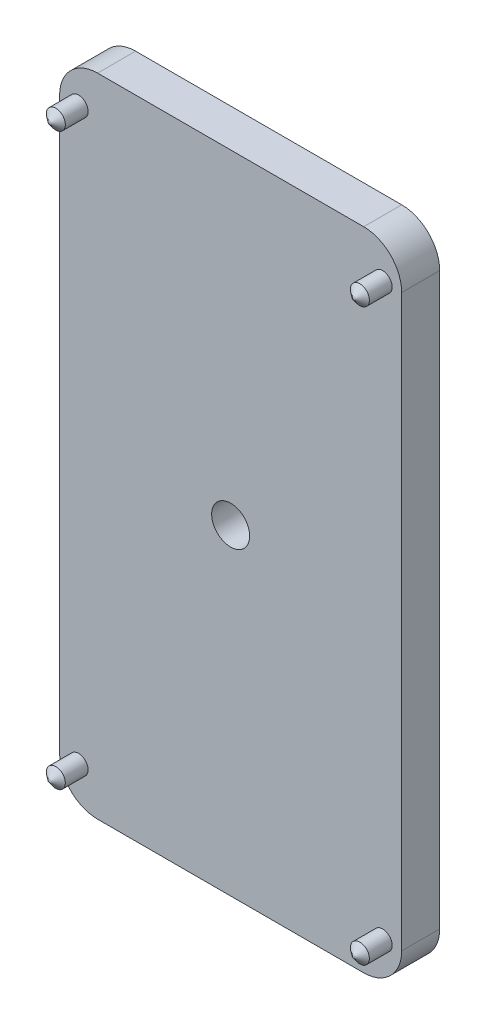
ISO-10303-21;
HEADER;
FILE_DESCRIPTION(('STEP AP214'),'2;1');
FILE_NAME('part.step','',(''),(''),'','','');
FILE_SCHEMA(('AUTOMOTIVE_DESIGN { 1 0 10303 214 1 1 1 1 }'));
ENDSEC;
DATA;
#1=APPLICATION_CONTEXT('core data for automotive mechanical design processes');
#2=APPLICATION_PROTOCOL_DEFINITION('international standard','automotive_design',2000,#1);
#3=PRODUCT_CONTEXT('',#1,'mechanical');
#4=PRODUCT('Part','Part','',(#3));
#5=PRODUCT_RELATED_PRODUCT_CATEGORY('part','',(#4));
#6=PRODUCT_DEFINITION_FORMATION('','',#4);
#7=PRODUCT_DEFINITION_CONTEXT('part definition',#1,'design');
#8=PRODUCT_DEFINITION('design','',#6,#7);
#9=PRODUCT_DEFINITION_SHAPE('','',#8);
#10=(LENGTH_UNIT() NAMED_UNIT(*) SI_UNIT(.MILLI.,.METRE.));
#11=(NAMED_UNIT(*) PLANE_ANGLE_UNIT() SI_UNIT($,.RADIAN.));
#12=(NAMED_UNIT(*) SI_UNIT($,.STERADIAN.) SOLID_ANGLE_UNIT());
#13=UNCERTAINTY_MEASURE_WITH_UNIT(LENGTH_MEASURE(1.E-05),#10,'distance_accuracy_value','');
#14=(GEOMETRIC_REPRESENTATION_CONTEXT(3) GLOBAL_UNCERTAINTY_ASSIGNED_CONTEXT((#13)) GLOBAL_UNIT_ASSIGNED_CONTEXT((#10,
#11,#12)) REPRESENTATION_CONTEXT('',''));
#15=CARTESIAN_POINT('',(0.,0.,0.));
#16=DIRECTION('',(0.,0.,1.));
#17=DIRECTION('',(1.,0.,0.));
#18=AXIS2_PLACEMENT_3D('',#15,#16,#17);
#19=CARTESIAN_POINT('',(0.,0.,0.));
#20=DIRECTION('',(0.,0.,-1.));
#21=DIRECTION('',(-1.,0.,0.));
#22=AXIS2_PLACEMENT_3D('',#19,#20,#21);
#23=PLANE('',#22);
#24=CARTESIAN_POINT('',(45.,84.5110045,0.));
#25=DIRECTION('',(0.,0.,-1.));
#26=DIRECTION('',(-1.,0.,0.));
#27=AXIS2_PLACEMENT_3D('',#24,#25,#26);
#28=CIRCLE('',#27,5.);
#29=CARTESIAN_POINT('',(40.,84.5110045,0.));
#30=VERTEX_POINT('',#29);
#31=EDGE_CURVE('E172',#30,#30,#28,.T.);
#32=ORIENTED_EDGE('',*,*,#31,.F.);
#33=EDGE_LOOP('',(#32));
#34=FACE_BOUND('',#33,.T.);
#35=DIRECTION('',(0.,1.,0.));
#36=VECTOR('',#35,1.);
#37=CARTESIAN_POINT('',(90.,0.,0.));
#38=LINE('',#37,#36);
#39=CARTESIAN_POINT('',(90.,10.,0.));
#40=VERTEX_POINT('',#39);
#41=CARTESIAN_POINT('',(90.,160.,0.));
#42=VERTEX_POINT('',#41);
#43=EDGE_CURVE('E153',#40,#42,#38,.T.);
#44=ORIENTED_EDGE('',*,*,#43,.F.);
#45=CARTESIAN_POINT('',(80.,10.,0.));
#46=DIRECTION('',(0.,0.,-1.));
#47=DIRECTION('',(-1.,0.,0.));
#48=AXIS2_PLACEMENT_3D('',#45,#46,#47);
#49=CIRCLE('',#48,10.);
#50=CARTESIAN_POINT('',(80.,0.,0.));
#51=VERTEX_POINT('',#50);
#52=EDGE_CURVE('E57',#40,#51,#49,.T.);
#53=ORIENTED_EDGE('',*,*,#52,.T.);
#54=DIRECTION('',(1.,0.,0.));
#55=VECTOR('',#54,1.);
#56=CARTESIAN_POINT('',(0.,0.,0.));
#57=LINE('',#56,#55);
#58=CARTESIAN_POINT('',(10.,0.,0.));
#59=VERTEX_POINT('',#58);
#60=EDGE_CURVE('E151',#59,#51,#57,.T.);
#61=ORIENTED_EDGE('',*,*,#60,.F.);
#62=CARTESIAN_POINT('',(10.,10.,0.));
#63=DIRECTION('',(0.,0.,-1.));
#64=DIRECTION('',(-1.,0.,0.));
#65=AXIS2_PLACEMENT_3D('',#62,#63,#64);
#66=CIRCLE('',#65,10.);
#67=CARTESIAN_POINT('',(0.,10.,0.));
#68=VERTEX_POINT('',#67);
#69=EDGE_CURVE('E195',#59,#68,#66,.T.);
#70=ORIENTED_EDGE('',*,*,#69,.T.);
#71=DIRECTION('',(0.,-1.,0.));
#72=VECTOR('',#71,1.);
#73=CARTESIAN_POINT('',(0.,0.,0.));
#74=LINE('',#73,#72);
#75=CARTESIAN_POINT('',(0.,160.,0.));
#76=VERTEX_POINT('',#75);
#77=EDGE_CURVE('E136',#76,#68,#74,.T.);
#78=ORIENTED_EDGE('',*,*,#77,.F.);
#79=CARTESIAN_POINT('',(10.,160.,0.));
#80=DIRECTION('',(0.,0.,-1.));
#81=DIRECTION('',(-1.,0.,0.));
#82=AXIS2_PLACEMENT_3D('',#79,#80,#81);
#83=CIRCLE('',#82,10.);
#84=CARTESIAN_POINT('',(10.,170.,0.));
#85=VERTEX_POINT('',#84);
#86=EDGE_CURVE('E186',#76,#85,#83,.T.);
#87=ORIENTED_EDGE('',*,*,#86,.T.);
#88=DIRECTION('',(-1.,0.,0.));
#89=VECTOR('',#88,1.);
#90=CARTESIAN_POINT('',(0.,170.,0.));
#91=LINE('',#90,#89);
#92=CARTESIAN_POINT('',(80.,170.,0.));
#93=VERTEX_POINT('',#92);
#94=EDGE_CURVE('E141',#93,#85,#91,.T.);
#95=ORIENTED_EDGE('',*,*,#94,.F.);
#96=CARTESIAN_POINT('',(80.,160.,0.));
#97=DIRECTION('',(0.,0.,-1.));
#98=DIRECTION('',(-1.,0.,0.));
#99=AXIS2_PLACEMENT_3D('',#96,#97,#98);
#100=CIRCLE('',#99,10.);
#101=EDGE_CURVE('E175',#93,#42,#100,.T.);
#102=ORIENTED_EDGE('',*,*,#101,.T.);
#103=EDGE_LOOP('',(#44,#53,#61,#70,#78,#87,#95,#102));
#104=FACE_BOUND('',#103,.T.);
#105=CARTESIAN_POINT('',(45.,150.,0.));
#106=DIRECTION('',(0.,0.,-1.));
#107=DIRECTION('',(-1.,0.,0.));
#108=AXIS2_PLACEMENT_3D('',#105,#106,#107);
#109=CIRCLE('',#108,2.5);
#110=CARTESIAN_POINT('',(42.5,150.,0.));
#111=VERTEX_POINT('',#110);
#112=EDGE_CURVE('E127',#111,#111,#109,.T.);
#113=ORIENTED_EDGE('',*,*,#112,.F.);
#114=EDGE_LOOP('',(#113));
#115=FACE_BOUND('',#114,.T.);
#116=ADVANCED_FACE('F35',(#34,#104,#115),#23,.T.);
#117=CARTESIAN_POINT('',(0.,0.,10.));
#118=DIRECTION('',(0.,0.,-1.));
#119=DIRECTION('',(-1.,0.,0.));
#120=AXIS2_PLACEMENT_3D('',#117,#118,#119);
#121=PLANE('',#120);
#122=CARTESIAN_POINT('',(45.,84.5110045,10.));
#123=DIRECTION('',(0.,0.,-1.));
#124=DIRECTION('',(-1.,0.,0.));
#125=AXIS2_PLACEMENT_3D('',#122,#123,#124);
#126=CIRCLE('',#125,5.);
#127=CARTESIAN_POINT('',(40.,84.5110045,10.));
#128=VERTEX_POINT('',#127);
#129=EDGE_CURVE('E169',#128,#128,#126,.T.);
#130=ORIENTED_EDGE('',*,*,#129,.T.);
#131=EDGE_LOOP('',(#130));
#132=FACE_BOUND('',#131,.T.);
#133=CARTESIAN_POINT('',(85.,10.,10.));
#134=DIRECTION('',(0.,0.,-1.));
#135=DIRECTION('',(-1.,0.,0.));
#136=AXIS2_PLACEMENT_3D('',#133,#134,#135);
#137=CIRCLE('',#136,2.5);
#138=CARTESIAN_POINT('',(82.5,10.,10.));
#139=VERTEX_POINT('',#138);
#140=EDGE_CURVE('E162',#139,#139,#137,.F.);
#141=ORIENTED_EDGE('',*,*,#140,.F.);
#142=EDGE_LOOP('',(#141));
#143=FACE_BOUND('',#142,.T.);
#144=CARTESIAN_POINT('',(5.,160.,10.));
#145=DIRECTION('',(0.,0.,-1.));
#146=DIRECTION('',(-1.,0.,0.));
#147=AXIS2_PLACEMENT_3D('',#144,#145,#146);
#148=CIRCLE('',#147,2.5);
#149=CARTESIAN_POINT('',(2.5,160.,10.));
#150=VERTEX_POINT('',#149);
#151=EDGE_CURVE('E148',#150,#150,#148,.F.);
#152=ORIENTED_EDGE('',*,*,#151,.F.);
#153=EDGE_LOOP('',(#152));
#154=FACE_BOUND('',#153,.T.);
#155=DIRECTION('',(1.,0.,0.));
#156=VECTOR('',#155,1.);
#157=CARTESIAN_POINT('',(0.,0.,10.));
#158=LINE('',#157,#156);
#159=CARTESIAN_POINT('',(10.,0.,10.));
#160=VERTEX_POINT('',#159);
#161=CARTESIAN_POINT('',(80.,0.,10.));
#162=VERTEX_POINT('',#161);
#163=EDGE_CURVE('E140',#160,#162,#158,.T.);
#164=ORIENTED_EDGE('',*,*,#163,.T.);
#165=CARTESIAN_POINT('',(80.,10.,10.));
#166=DIRECTION('',(0.,0.,-1.));
#167=DIRECTION('',(-1.,0.,0.));
#168=AXIS2_PLACEMENT_3D('',#165,#166,#167);
#169=CIRCLE('',#168,10.);
#170=CARTESIAN_POINT('',(90.,10.,10.));
#171=VERTEX_POINT('',#170);
#172=EDGE_CURVE('E11',#162,#171,#169,.F.);
#173=ORIENTED_EDGE('',*,*,#172,.T.);
#174=DIRECTION('',(0.,1.,0.));
#175=VECTOR('',#174,1.);
#176=CARTESIAN_POINT('',(90.,0.,10.));
#177=LINE('',#176,#175);
#178=CARTESIAN_POINT('',(90.,160.,10.));
#179=VERTEX_POINT('',#178);
#180=EDGE_CURVE('E143',#171,#179,#177,.T.);
#181=ORIENTED_EDGE('',*,*,#180,.T.);
#182=CARTESIAN_POINT('',(80.,160.,10.));
#183=DIRECTION('',(0.,0.,-1.));
#184=DIRECTION('',(-1.,0.,0.));
#185=AXIS2_PLACEMENT_3D('',#182,#183,#184);
#186=CIRCLE('',#185,10.);
#187=CARTESIAN_POINT('',(80.,170.,10.));
#188=VERTEX_POINT('',#187);
#189=EDGE_CURVE('E181',#179,#188,#186,.F.);
#190=ORIENTED_EDGE('',*,*,#189,.T.);
#191=DIRECTION('',(-1.,0.,0.));
#192=VECTOR('',#191,1.);
#193=CARTESIAN_POINT('',(0.,170.,10.));
#194=LINE('',#193,#192);
#195=CARTESIAN_POINT('',(10.,170.,10.));
#196=VERTEX_POINT('',#195);
#197=EDGE_CURVE('E145',#188,#196,#194,.T.);
#198=ORIENTED_EDGE('',*,*,#197,.T.);
#199=CARTESIAN_POINT('',(10.,160.,10.));
#200=DIRECTION('',(0.,0.,-1.));
#201=DIRECTION('',(-1.,0.,0.));
#202=AXIS2_PLACEMENT_3D('',#199,#200,#201);
#203=CIRCLE('',#202,10.);
#204=CARTESIAN_POINT('',(0.,160.,10.));
#205=VERTEX_POINT('',#204);
#206=EDGE_CURVE('E190',#196,#205,#203,.F.);
#207=ORIENTED_EDGE('',*,*,#206,.T.);
#208=DIRECTION('',(0.,-1.,0.));
#209=VECTOR('',#208,1.);
#210=CARTESIAN_POINT('',(0.,0.,10.));
#211=LINE('',#210,#209);
#212=CARTESIAN_POINT('',(0.,10.,10.));
#213=VERTEX_POINT('',#212);
#214=EDGE_CURVE('E137',#205,#213,#211,.T.);
#215=ORIENTED_EDGE('',*,*,#214,.T.);
#216=CARTESIAN_POINT('',(10.,10.,10.));
#217=DIRECTION('',(0.,0.,-1.));
#218=DIRECTION('',(-1.,0.,0.));
#219=AXIS2_PLACEMENT_3D('',#216,#217,#218);
#220=CIRCLE('',#219,10.);
#221=EDGE_CURVE('E199',#213,#160,#220,.F.);
#222=ORIENTED_EDGE('',*,*,#221,.T.);
#223=EDGE_LOOP('',(#164,#173,#181,#190,#198,#207,#215,#222));
#224=FACE_BOUND('',#223,.T.);
#225=CARTESIAN_POINT('',(85.,160.,10.));
#226=DIRECTION('',(0.,0.,-1.));
#227=DIRECTION('',(-1.,0.,0.));
#228=AXIS2_PLACEMENT_3D('',#225,#226,#227);
#229=CIRCLE('',#228,2.5);
#230=CARTESIAN_POINT('',(82.5,160.,10.));
#231=VERTEX_POINT('',#230);
#232=EDGE_CURVE('E159',#231,#231,#229,.F.);
#233=ORIENTED_EDGE('',*,*,#232,.F.);
#234=EDGE_LOOP('',(#233));
#235=FACE_BOUND('',#234,.T.);
#236=CARTESIAN_POINT('',(5.,10.,10.));
#237=DIRECTION('',(0.,0.,-1.));
#238=DIRECTION('',(-1.,0.,0.));
#239=AXIS2_PLACEMENT_3D('',#236,#237,#238);
#240=CIRCLE('',#239,2.5);
#241=CARTESIAN_POINT('',(2.5,10.,10.));
#242=VERTEX_POINT('',#241);
#243=EDGE_CURVE('E165',#242,#242,#240,.F.);
#244=ORIENTED_EDGE('',*,*,#243,.F.);
#245=EDGE_LOOP('',(#244));
#246=FACE_BOUND('',#245,.T.);
#247=ADVANCED_FACE('F219',(#132,#143,#154,#224,#235,#246),#121,.F.);
#248=CARTESIAN_POINT('',(0.,0.,10.));
#249=DIRECTION('',(1.,0.,0.));
#250=DIRECTION('',(0.,0.,-1.));
#251=AXIS2_PLACEMENT_3D('',#248,#249,#250);
#252=PLANE('',#251);
#253=ORIENTED_EDGE('',*,*,#77,.T.);
#254=DIRECTION('',(0.,0.,-1.));
#255=VECTOR('',#254,1.);
#256=CARTESIAN_POINT('',(0.,10.,10.));
#257=LINE('',#256,#255);
#258=EDGE_CURVE('E197',#68,#213,#257,.F.);
#259=ORIENTED_EDGE('',*,*,#258,.T.);
#260=ORIENTED_EDGE('',*,*,#214,.F.);
#261=DIRECTION('',(0.,0.,-1.));
#262=VECTOR('',#261,1.);
#263=CARTESIAN_POINT('',(0.,160.,10.));
#264=LINE('',#263,#262);
#265=EDGE_CURVE('E183',#205,#76,#264,.T.);
#266=ORIENTED_EDGE('',*,*,#265,.T.);
#267=EDGE_LOOP('',(#253,#259,#260,#266));
#268=FACE_BOUND('',#267,.T.);
#269=ADVANCED_FACE('F231',(#268),#252,.F.);
#270=CARTESIAN_POINT('',(0.,0.,10.));
#271=DIRECTION('',(0.,1.,0.));
#272=DIRECTION('',(0.,0.,1.));
#273=AXIS2_PLACEMENT_3D('',#270,#271,#272);
#274=PLANE('',#273);
#275=ORIENTED_EDGE('',*,*,#60,.T.);
#276=DIRECTION('',(0.,0.,-1.));
#277=VECTOR('',#276,1.);
#278=CARTESIAN_POINT('',(80.,0.,10.));
#279=LINE('',#278,#277);
#280=EDGE_CURVE('E43',#51,#162,#279,.F.);
#281=ORIENTED_EDGE('',*,*,#280,.T.);
#282=ORIENTED_EDGE('',*,*,#163,.F.);
#283=DIRECTION('',(0.,0.,-1.));
#284=VECTOR('',#283,1.);
#285=CARTESIAN_POINT('',(10.,0.,10.));
#286=LINE('',#285,#284);
#287=EDGE_CURVE('E192',#160,#59,#286,.T.);
#288=ORIENTED_EDGE('',*,*,#287,.T.);
#289=EDGE_LOOP('',(#275,#281,#282,#288));
#290=FACE_BOUND('',#289,.T.);
#291=ADVANCED_FACE('F237',(#290),#274,.F.);
#292=CARTESIAN_POINT('',(90.,0.,10.));
#293=DIRECTION('',(-1.,0.,0.));
#294=DIRECTION('',(0.,0.,1.));
#295=AXIS2_PLACEMENT_3D('',#292,#293,#294);
#296=PLANE('',#295);
#297=ORIENTED_EDGE('',*,*,#180,.F.);
#298=DIRECTION('',(0.,0.,-1.));
#299=VECTOR('',#298,1.);
#300=CARTESIAN_POINT('',(90.,10.,10.));
#301=LINE('',#300,#299);
#302=EDGE_CURVE('E201',#171,#40,#301,.T.);
#303=ORIENTED_EDGE('',*,*,#302,.T.);
#304=ORIENTED_EDGE('',*,*,#43,.T.);
#305=DIRECTION('',(0.,0.,-1.));
#306=VECTOR('',#305,1.);
#307=CARTESIAN_POINT('',(90.,160.,10.));
#308=LINE('',#307,#306);
#309=EDGE_CURVE('E178',#42,#179,#308,.F.);
#310=ORIENTED_EDGE('',*,*,#309,.T.);
#311=EDGE_LOOP('',(#297,#303,#304,#310));
#312=FACE_BOUND('',#311,.T.);
#313=ADVANCED_FACE('F207',(#312),#296,.F.);
#314=CARTESIAN_POINT('',(0.,170.,10.));
#315=DIRECTION('',(0.,-1.,0.));
#316=DIRECTION('',(0.,0.,-1.));
#317=AXIS2_PLACEMENT_3D('',#314,#315,#316);
#318=PLANE('',#317);
#319=ORIENTED_EDGE('',*,*,#94,.T.);
#320=DIRECTION('',(0.,0.,-1.));
#321=VECTOR('',#320,1.);
#322=CARTESIAN_POINT('',(10.,170.,10.));
#323=LINE('',#322,#321);
#324=EDGE_CURVE('E188',#85,#196,#323,.F.);
#325=ORIENTED_EDGE('',*,*,#324,.T.);
#326=ORIENTED_EDGE('',*,*,#197,.F.);
#327=DIRECTION('',(0.,0.,-1.));
#328=VECTOR('',#327,1.);
#329=CARTESIAN_POINT('',(80.,170.,10.));
#330=LINE('',#329,#328);
#331=EDGE_CURVE('E168',#188,#93,#330,.T.);
#332=ORIENTED_EDGE('',*,*,#331,.T.);
#333=EDGE_LOOP('',(#319,#325,#326,#332));
#334=FACE_BOUND('',#333,.T.);
#335=ADVANCED_FACE('F223',(#334),#318,.F.);
#336=CARTESIAN_POINT('',(5.,160.,16.));
#337=DIRECTION('',(0.,0.,-1.));
#338=DIRECTION('',(-1.,0.,0.));
#339=AXIS2_PLACEMENT_3D('',#336,#337,#338);
#340=CYLINDRICAL_SURFACE('',#339,2.5);
#341=CARTESIAN_POINT('',(5.,160.,16.));
#342=DIRECTION('',(0.,0.,1.));
#343=DIRECTION('',(1.,0.,0.));
#344=AXIS2_PLACEMENT_3D('',#341,#342,#343);
#345=CIRCLE('',#344,2.5);
#346=CARTESIAN_POINT('',(7.5,160.,16.));
#347=VERTEX_POINT('',#346);
#348=EDGE_CURVE('E133',#347,#347,#345,.T.);
#349=ORIENTED_EDGE('',*,*,#348,.F.);
#350=EDGE_LOOP('',(#349));
#351=FACE_BOUND('',#350,.T.);
#352=ORIENTED_EDGE('',*,*,#151,.T.);
#353=EDGE_LOOP('',(#352));
#354=FACE_BOUND('',#353,.T.);
#355=ADVANCED_FACE('F256',(#351,#354),#340,.T.);
#356=CARTESIAN_POINT('',(85.,160.,16.));
#357=DIRECTION('',(0.,0.,-1.));
#358=DIRECTION('',(-1.,0.,0.));
#359=AXIS2_PLACEMENT_3D('',#356,#357,#358);
#360=CYLINDRICAL_SURFACE('',#359,2.5);
#361=CARTESIAN_POINT('',(85.,160.,16.));
#362=DIRECTION('',(0.,0.,1.));
#363=DIRECTION('',(1.,0.,0.));
#364=AXIS2_PLACEMENT_3D('',#361,#362,#363);
#365=CIRCLE('',#364,2.5);
#366=CARTESIAN_POINT('',(87.5,160.,16.));
#367=VERTEX_POINT('',#366);
#368=EDGE_CURVE('E124',#367,#367,#365,.T.);
#369=ORIENTED_EDGE('',*,*,#368,.F.);
#370=EDGE_LOOP('',(#369));
#371=FACE_BOUND('',#370,.T.);
#372=ORIENTED_EDGE('',*,*,#232,.T.);
#373=EDGE_LOOP('',(#372));
#374=FACE_BOUND('',#373,.T.);
#375=ADVANCED_FACE('F311',(#371,#374),#360,.T.);
#376=CARTESIAN_POINT('',(85.,10.,16.));
#377=DIRECTION('',(0.,0.,-1.));
#378=DIRECTION('',(-1.,0.,0.));
#379=AXIS2_PLACEMENT_3D('',#376,#377,#378);
#380=CYLINDRICAL_SURFACE('',#379,2.5);
#381=CARTESIAN_POINT('',(85.,10.,16.));
#382=DIRECTION('',(0.,0.,1.));
#383=DIRECTION('',(1.,0.,0.));
#384=AXIS2_PLACEMENT_3D('',#381,#382,#383);
#385=CIRCLE('',#384,2.5);
#386=CARTESIAN_POINT('',(87.5,10.,16.));
#387=VERTEX_POINT('',#386);
#388=EDGE_CURVE('E120',#387,#387,#385,.T.);
#389=ORIENTED_EDGE('',*,*,#388,.F.);
#390=EDGE_LOOP('',(#389));
#391=FACE_BOUND('',#390,.T.);
#392=ORIENTED_EDGE('',*,*,#140,.T.);
#393=EDGE_LOOP('',(#392));
#394=FACE_BOUND('',#393,.T.);
#395=ADVANCED_FACE('F318',(#391,#394),#380,.T.);
#396=CARTESIAN_POINT('',(5.,10.,16.));
#397=DIRECTION('',(0.,0.,-1.));
#398=DIRECTION('',(-1.,0.,0.));
#399=AXIS2_PLACEMENT_3D('',#396,#397,#398);
#400=CYLINDRICAL_SURFACE('',#399,2.5);
#401=CARTESIAN_POINT('',(5.,10.,16.));
#402=DIRECTION('',(0.,0.,1.));
#403=DIRECTION('',(1.,0.,0.));
#404=AXIS2_PLACEMENT_3D('',#401,#402,#403);
#405=CIRCLE('',#404,2.5);
#406=CARTESIAN_POINT('',(7.5,10.,16.));
#407=VERTEX_POINT('',#406);
#408=EDGE_CURVE('E118',#407,#407,#405,.T.);
#409=ORIENTED_EDGE('',*,*,#408,.F.);
#410=EDGE_LOOP('',(#409));
#411=FACE_BOUND('',#410,.T.);
#412=ORIENTED_EDGE('',*,*,#243,.T.);
#413=EDGE_LOOP('',(#412));
#414=FACE_BOUND('',#413,.T.);
#415=ADVANCED_FACE('F326',(#411,#414),#400,.T.);
#416=CARTESIAN_POINT('',(5.,160.,16.));
#417=DIRECTION('',(0.,0.,-1.));
#418=DIRECTION('',(1.,0.,0.));
#419=AXIS2_PLACEMENT_3D('',#416,#417,#418);
#420=CONICAL_SURFACE('',#419,2.5,0.907571211037052);
#421=CARTESIAN_POINT('',(5.,160.,17.9532140662668));
#422=VERTEX_POINT('',#421);
#423=VERTEX_LOOP('',#422);
#424=FACE_BOUND('',#423,.T.);
#425=ORIENTED_EDGE('',*,*,#348,.T.);
#426=EDGE_LOOP('',(#425));
#427=FACE_BOUND('',#426,.T.);
#428=ADVANCED_FACE('F334',(#424,#427),#420,.T.);
#429=CARTESIAN_POINT('',(85.,160.,16.));
#430=DIRECTION('',(0.,0.,-1.));
#431=DIRECTION('',(1.,0.,0.));
#432=AXIS2_PLACEMENT_3D('',#429,#430,#431);
#433=CONICAL_SURFACE('',#432,2.50000000000001,0.907571211037052);
#434=CARTESIAN_POINT('',(85.,160.,17.9532140662668));
#435=VERTEX_POINT('',#434);
#436=VERTEX_LOOP('',#435);
#437=FACE_BOUND('',#436,.T.);
#438=ORIENTED_EDGE('',*,*,#368,.T.);
#439=EDGE_LOOP('',(#438));
#440=FACE_BOUND('',#439,.T.);
#441=ADVANCED_FACE('F341',(#437,#440),#433,.T.);
#442=CARTESIAN_POINT('',(85.,10.,16.));
#443=DIRECTION('',(0.,0.,-1.));
#444=DIRECTION('',(1.,0.,0.));
#445=AXIS2_PLACEMENT_3D('',#442,#443,#444);
#446=CONICAL_SURFACE('',#445,2.5,0.907571211037052);
#447=CARTESIAN_POINT('',(85.,10.,17.9532140662668));
#448=VERTEX_POINT('',#447);
#449=VERTEX_LOOP('',#448);
#450=FACE_BOUND('',#449,.T.);
#451=ORIENTED_EDGE('',*,*,#388,.T.);
#452=EDGE_LOOP('',(#451));
#453=FACE_BOUND('',#452,.T.);
#454=ADVANCED_FACE('F114',(#450,#453),#446,.T.);
#455=CARTESIAN_POINT('',(5.,10.,16.));
#456=DIRECTION('',(0.,0.,-1.));
#457=DIRECTION('',(1.,0.,0.));
#458=AXIS2_PLACEMENT_3D('',#455,#456,#457);
#459=CONICAL_SURFACE('',#458,2.5,0.907571211037052);
#460=CARTESIAN_POINT('',(5.,10.,17.9532140662668));
#461=VERTEX_POINT('',#460);
#462=VERTEX_LOOP('',#461);
#463=FACE_BOUND('',#462,.T.);
#464=ORIENTED_EDGE('',*,*,#408,.T.);
#465=EDGE_LOOP('',(#464));
#466=FACE_BOUND('',#465,.T.);
#467=ADVANCED_FACE('F110',(#463,#466),#459,.T.);
#468=CARTESIAN_POINT('',(45.,150.,-15.));
#469=DIRECTION('',(0.,0.,1.));
#470=DIRECTION('',(1.,0.,0.));
#471=AXIS2_PLACEMENT_3D('',#468,#469,#470);
#472=CYLINDRICAL_SURFACE('',#471,2.5);
#473=CARTESIAN_POINT('',(45.,150.,-15.));
#474=DIRECTION('',(0.,0.,-1.));
#475=DIRECTION('',(-1.,0.,0.));
#476=AXIS2_PLACEMENT_3D('',#473,#474,#475);
#477=CIRCLE('',#476,2.5);
#478=CARTESIAN_POINT('',(42.5,150.,-15.));
#479=VERTEX_POINT('',#478);
#480=EDGE_CURVE('E121',#479,#479,#477,.T.);
#481=ORIENTED_EDGE('',*,*,#480,.F.);
#482=EDGE_LOOP('',(#481));
#483=FACE_BOUND('',#482,.T.);
#484=ORIENTED_EDGE('',*,*,#112,.T.);
#485=EDGE_LOOP('',(#484));
#486=FACE_BOUND('',#485,.T.);
#487=ADVANCED_FACE('F113',(#483,#486),#472,.T.);
#488=CARTESIAN_POINT('',(45.,150.,-15.));
#489=DIRECTION('',(0.,0.,-1.));
#490=DIRECTION('',(-1.,0.,0.));
#491=AXIS2_PLACEMENT_3D('',#488,#489,#490);
#492=PLANE('',#491);
#493=ORIENTED_EDGE('',*,*,#480,.T.);
#494=EDGE_LOOP('',(#493));
#495=FACE_BOUND('',#494,.T.);
#496=ADVANCED_FACE('F367',(#495),#492,.T.);
#497=CARTESIAN_POINT('',(45.,84.5110045,15.));
#498=DIRECTION('',(0.,0.,-1.));
#499=DIRECTION('',(-1.,0.,0.));
#500=AXIS2_PLACEMENT_3D('',#497,#498,#499);
#501=CYLINDRICAL_SURFACE('',#500,5.);
#502=ORIENTED_EDGE('',*,*,#31,.T.);
#503=EDGE_LOOP('',(#502));
#504=FACE_BOUND('',#503,.T.);
#505=ORIENTED_EDGE('',*,*,#129,.F.);
#506=EDGE_LOOP('',(#505));
#507=FACE_BOUND('',#506,.T.);
#508=ADVANCED_FACE('F265',(#504,#507),#501,.F.);
#509=CARTESIAN_POINT('',(80.,160.,10.));
#510=DIRECTION('',(0.,0.,-1.));
#511=DIRECTION('',(-1.,0.,0.));
#512=AXIS2_PLACEMENT_3D('',#509,#510,#511);
#513=CYLINDRICAL_SURFACE('',#512,10.);
#514=ORIENTED_EDGE('',*,*,#189,.F.);
#515=ORIENTED_EDGE('',*,*,#309,.F.);
#516=ORIENTED_EDGE('',*,*,#101,.F.);
#517=ORIENTED_EDGE('',*,*,#331,.F.);
#518=EDGE_LOOP('',(#514,#515,#516,#517));
#519=FACE_BOUND('',#518,.T.);
#520=ADVANCED_FACE('F216',(#519),#513,.T.);
#521=CARTESIAN_POINT('',(10.,160.,10.));
#522=DIRECTION('',(0.,0.,-1.));
#523=DIRECTION('',(-1.,0.,0.));
#524=AXIS2_PLACEMENT_3D('',#521,#522,#523);
#525=CYLINDRICAL_SURFACE('',#524,10.);
#526=ORIENTED_EDGE('',*,*,#206,.F.);
#527=ORIENTED_EDGE('',*,*,#324,.F.);
#528=ORIENTED_EDGE('',*,*,#86,.F.);
#529=ORIENTED_EDGE('',*,*,#265,.F.);
#530=EDGE_LOOP('',(#526,#527,#528,#529));
#531=FACE_BOUND('',#530,.T.);
#532=ADVANCED_FACE('F226',(#531),#525,.T.);
#533=CARTESIAN_POINT('',(10.,10.,10.));
#534=DIRECTION('',(0.,0.,-1.));
#535=DIRECTION('',(-1.,0.,0.));
#536=AXIS2_PLACEMENT_3D('',#533,#534,#535);
#537=CYLINDRICAL_SURFACE('',#536,10.);
#538=ORIENTED_EDGE('',*,*,#221,.F.);
#539=ORIENTED_EDGE('',*,*,#258,.F.);
#540=ORIENTED_EDGE('',*,*,#69,.F.);
#541=ORIENTED_EDGE('',*,*,#287,.F.);
#542=EDGE_LOOP('',(#538,#539,#540,#541));
#543=FACE_BOUND('',#542,.T.);
#544=ADVANCED_FACE('F235',(#543),#537,.T.);
#545=CARTESIAN_POINT('',(80.,10.,10.));
#546=DIRECTION('',(0.,0.,-1.));
#547=DIRECTION('',(-1.,0.,0.));
#548=AXIS2_PLACEMENT_3D('',#545,#546,#547);
#549=CYLINDRICAL_SURFACE('',#548,10.);
#550=ORIENTED_EDGE('',*,*,#172,.F.);
#551=ORIENTED_EDGE('',*,*,#280,.F.);
#552=ORIENTED_EDGE('',*,*,#52,.F.);
#553=ORIENTED_EDGE('',*,*,#302,.F.);
#554=EDGE_LOOP('',(#550,#551,#552,#553));
#555=FACE_BOUND('',#554,.T.);
#556=ADVANCED_FACE('F37',(#555),#549,.T.);
#557=CLOSED_SHELL('',(#116,#247,#269,#291,#313,#335,#355,#375,#395,#415,#428,#441,#454,#467,
#487,#496,#508,#520,#532,#544,#556));
#558=MANIFOLD_SOLID_BREP('B2',#557);
#559=ADVANCED_BREP_SHAPE_REPRESENTATION('',(#18,#558),#14);
#560=SHAPE_DEFINITION_REPRESENTATION(#9,#559);
ENDSEC;
END-ISO-10303-21;
